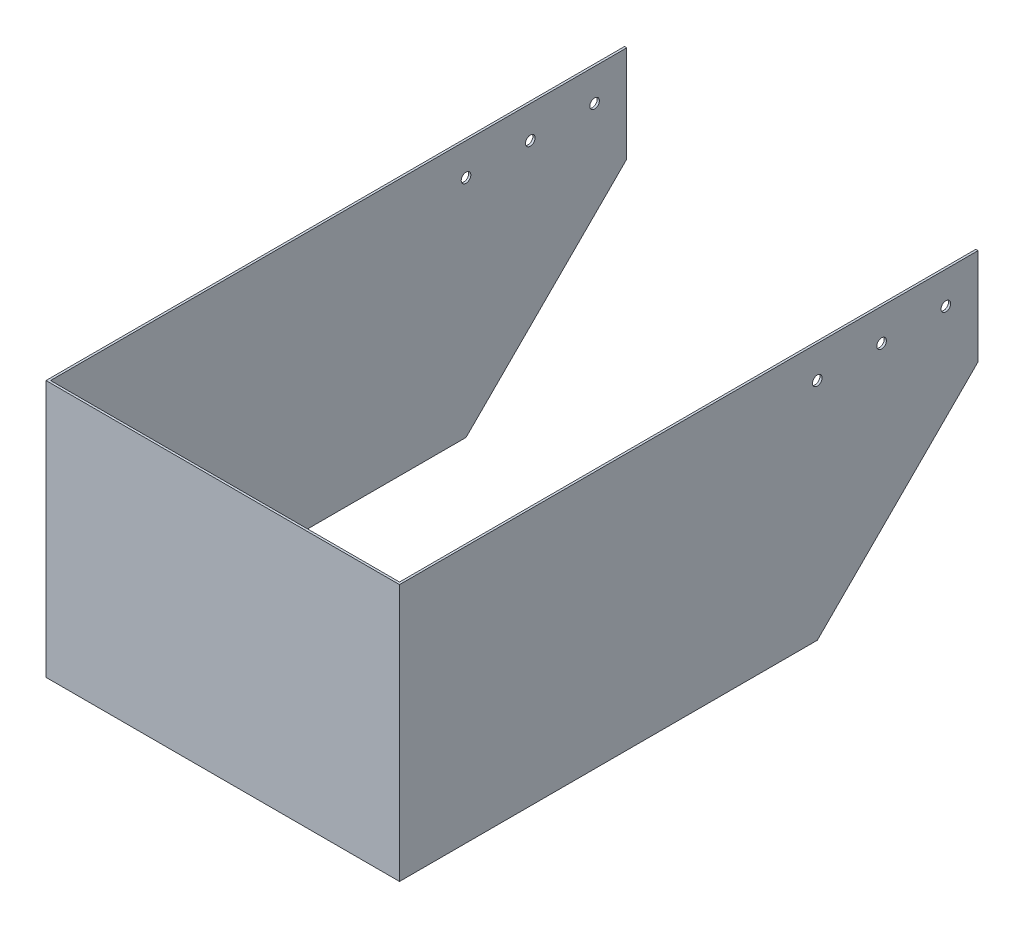
ISO-10303-21;
HEADER;
FILE_DESCRIPTION(('STEP AP214'),'2;1');
FILE_NAME('part.step','',(''),(''),'','','');
FILE_SCHEMA(('AUTOMOTIVE_DESIGN { 1 0 10303 214 1 1 1 1 }'));
ENDSEC;
DATA;
#1=APPLICATION_CONTEXT('core data for automotive mechanical design processes');
#2=APPLICATION_PROTOCOL_DEFINITION('international standard','automotive_design',2000,#1);
#3=PRODUCT_CONTEXT('',#1,'mechanical');
#4=PRODUCT('Part','Part','',(#3));
#5=PRODUCT_RELATED_PRODUCT_CATEGORY('part','',(#4));
#6=PRODUCT_DEFINITION_FORMATION('','',#4);
#7=PRODUCT_DEFINITION_CONTEXT('part definition',#1,'design');
#8=PRODUCT_DEFINITION('design','',#6,#7);
#9=PRODUCT_DEFINITION_SHAPE('','',#8);
#10=(LENGTH_UNIT() NAMED_UNIT(*) SI_UNIT(.MILLI.,.METRE.));
#11=(NAMED_UNIT(*) PLANE_ANGLE_UNIT() SI_UNIT($,.RADIAN.));
#12=(NAMED_UNIT(*) SI_UNIT($,.STERADIAN.) SOLID_ANGLE_UNIT());
#13=UNCERTAINTY_MEASURE_WITH_UNIT(LENGTH_MEASURE(1.E-05),#10,'distance_accuracy_value','');
#14=(GEOMETRIC_REPRESENTATION_CONTEXT(3) GLOBAL_UNCERTAINTY_ASSIGNED_CONTEXT((#13)) GLOBAL_UNIT_ASSIGNED_CONTEXT((#10,
#11,#12)) REPRESENTATION_CONTEXT('',''));
#15=CARTESIAN_POINT('',(0.,0.,0.));
#16=DIRECTION('',(0.,0.,1.));
#17=DIRECTION('',(1.,0.,0.));
#18=AXIS2_PLACEMENT_3D('',#15,#16,#17);
#19=CARTESIAN_POINT('',(0.,80.,-180.));
#20=DIRECTION('',(0.,0.,1.));
#21=DIRECTION('',(1.,0.,0.));
#22=AXIS2_PLACEMENT_3D('',#19,#20,#21);
#23=PLANE('',#22);
#24=DIRECTION('',(0.,1.,0.));
#25=VECTOR('',#24,1.);
#26=CARTESIAN_POINT('',(0.699999999999978,0.,-180.));
#27=LINE('',#26,#25);
#28=CARTESIAN_POINT('',(0.699999999999978,50.,-180.));
#29=VERTEX_POINT('',#28);
#30=CARTESIAN_POINT('',(0.699999999999978,80.,-180.));
#31=VERTEX_POINT('',#30);
#32=EDGE_CURVE('E131',#29,#31,#27,.T.);
#33=ORIENTED_EDGE('',*,*,#32,.F.);
#34=DIRECTION('',(1.,0.,0.));
#35=VECTOR('',#34,1.);
#36=CARTESIAN_POINT('',(-1.11022302462516E-13,50.,-180.));
#37=LINE('',#36,#35);
#38=CARTESIAN_POINT('',(-1.11022302462516E-13,50.,-180.));
#39=VERTEX_POINT('',#38);
#40=EDGE_CURVE('E55',#39,#29,#37,.T.);
#41=ORIENTED_EDGE('',*,*,#40,.F.);
#42=DIRECTION('',(0.,-1.,0.));
#43=VECTOR('',#42,1.);
#44=CARTESIAN_POINT('',(0.,80.,-180.));
#45=LINE('',#44,#43);
#46=CARTESIAN_POINT('',(0.,80.,-180.));
#47=VERTEX_POINT('',#46);
#48=EDGE_CURVE('E129',#47,#39,#45,.T.);
#49=ORIENTED_EDGE('',*,*,#48,.F.);
#50=DIRECTION('',(-1.,0.,0.));
#51=VECTOR('',#50,1.);
#52=CARTESIAN_POINT('',(0.,80.,-180.));
#53=LINE('',#52,#51);
#54=EDGE_CURVE('E147',#31,#47,#53,.T.);
#55=ORIENTED_EDGE('',*,*,#54,.F.);
#56=EDGE_LOOP('',(#33,#41,#49,#55));
#57=FACE_BOUND('',#56,.T.);
#58=ADVANCED_FACE('F39',(#57),#23,.F.);
#59=CARTESIAN_POINT('',(0.,80.,0.));
#60=DIRECTION('',(1.,0.,0.));
#61=DIRECTION('',(0.,0.,-1.));
#62=AXIS2_PLACEMENT_3D('',#59,#60,#61);
#63=PLANE('',#62);
#64=CARTESIAN_POINT('',(0.,70.,-170.));
#65=DIRECTION('',(1.,0.,0.));
#66=DIRECTION('',(0.,0.,-1.));
#67=AXIS2_PLACEMENT_3D('',#64,#65,#66);
#68=CIRCLE('',#67,1.5);
#69=CARTESIAN_POINT('',(0.,70.,-171.5));
#70=VERTEX_POINT('',#69);
#71=EDGE_CURVE('E164',#70,#70,#68,.T.);
#72=ORIENTED_EDGE('',*,*,#71,.T.);
#73=EDGE_LOOP('',(#72));
#74=FACE_BOUND('',#73,.T.);
#75=CARTESIAN_POINT('',(0.,70.,-130.));
#76=DIRECTION('',(1.,0.,0.));
#77=DIRECTION('',(0.,0.,-1.));
#78=AXIS2_PLACEMENT_3D('',#75,#76,#77);
#79=CIRCLE('',#78,1.5);
#80=CARTESIAN_POINT('',(0.,70.,-131.5));
#81=VERTEX_POINT('',#80);
#82=EDGE_CURVE('E261',#81,#81,#79,.T.);
#83=ORIENTED_EDGE('',*,*,#82,.T.);
#84=EDGE_LOOP('',(#83));
#85=FACE_BOUND('',#84,.T.);
#86=CARTESIAN_POINT('',(0.,70.,-150.));
#87=DIRECTION('',(1.,0.,0.));
#88=DIRECTION('',(0.,0.,-1.));
#89=AXIS2_PLACEMENT_3D('',#86,#87,#88);
#90=CIRCLE('',#89,1.49999999999997);
#91=CARTESIAN_POINT('',(0.,70.,-151.5));
#92=VERTEX_POINT('',#91);
#93=EDGE_CURVE('E269',#92,#92,#90,.T.);
#94=ORIENTED_EDGE('',*,*,#93,.T.);
#95=EDGE_LOOP('',(#94));
#96=FACE_BOUND('',#95,.T.);
#97=ORIENTED_EDGE('',*,*,#48,.T.);
#98=DIRECTION('',(0.,-0.707106781186547,0.707106781186548));
#99=VECTOR('',#98,1.);
#100=CARTESIAN_POINT('',(-1.11022302462516E-13,50.,-180.));
#101=LINE('',#100,#99);
#102=CARTESIAN_POINT('',(0.,0.,-130.));
#103=VERTEX_POINT('',#102);
#104=EDGE_CURVE('E114',#39,#103,#101,.T.);
#105=ORIENTED_EDGE('',*,*,#104,.T.);
#106=DIRECTION('',(0.,0.,1.));
#107=VECTOR('',#106,1.);
#108=CARTESIAN_POINT('',(0.,0.,0.));
#109=LINE('',#108,#107);
#110=CARTESIAN_POINT('',(0.,0.,0.));
#111=VERTEX_POINT('',#110);
#112=EDGE_CURVE('E212',#103,#111,#109,.T.);
#113=ORIENTED_EDGE('',*,*,#112,.T.);
#114=DIRECTION('',(0.,-1.,0.));
#115=VECTOR('',#114,1.);
#116=CARTESIAN_POINT('',(0.,80.,0.));
#117=LINE('',#116,#115);
#118=CARTESIAN_POINT('',(0.,80.,0.));
#119=VERTEX_POINT('',#118);
#120=EDGE_CURVE('E48',#119,#111,#117,.T.);
#121=ORIENTED_EDGE('',*,*,#120,.F.);
#122=DIRECTION('',(0.,0.,1.));
#123=VECTOR('',#122,1.);
#124=CARTESIAN_POINT('',(0.,80.,0.));
#125=LINE('',#124,#123);
#126=EDGE_CURVE('E136',#47,#119,#125,.T.);
#127=ORIENTED_EDGE('',*,*,#126,.F.);
#128=EDGE_LOOP('',(#97,#105,#113,#121,#127));
#129=FACE_BOUND('',#128,.T.);
#130=ADVANCED_FACE('F41',(#74,#85,#96,#129),#63,.F.);
#131=CARTESIAN_POINT('',(0.,80.,0.));
#132=DIRECTION('',(0.,0.,-1.));
#133=DIRECTION('',(-1.,0.,0.));
#134=AXIS2_PLACEMENT_3D('',#131,#132,#133);
#135=PLANE('',#134);
#136=DIRECTION('',(1.,0.,0.));
#137=VECTOR('',#136,1.);
#138=CARTESIAN_POINT('',(0.,0.,0.));
#139=LINE('',#138,#137);
#140=CARTESIAN_POINT('',(110.,0.,0.));
#141=VERTEX_POINT('',#140);
#142=EDGE_CURVE('E230',#111,#141,#139,.T.);
#143=ORIENTED_EDGE('',*,*,#142,.T.);
#144=DIRECTION('',(0.,-1.,0.));
#145=VECTOR('',#144,1.);
#146=CARTESIAN_POINT('',(110.,80.,0.));
#147=LINE('',#146,#145);
#148=CARTESIAN_POINT('',(110.,80.,0.));
#149=VERTEX_POINT('',#148);
#150=EDGE_CURVE('E144',#149,#141,#147,.T.);
#151=ORIENTED_EDGE('',*,*,#150,.F.);
#152=DIRECTION('',(1.,0.,0.));
#153=VECTOR('',#152,1.);
#154=CARTESIAN_POINT('',(0.,80.,0.));
#155=LINE('',#154,#153);
#156=EDGE_CURVE('E223',#119,#149,#155,.T.);
#157=ORIENTED_EDGE('',*,*,#156,.F.);
#158=ORIENTED_EDGE('',*,*,#120,.T.);
#159=EDGE_LOOP('',(#143,#151,#157,#158));
#160=FACE_BOUND('',#159,.T.);
#161=ADVANCED_FACE('F281',(#160),#135,.F.);
#162=CARTESIAN_POINT('',(110.,80.,0.));
#163=DIRECTION('',(-1.,0.,0.));
#164=DIRECTION('',(0.,0.,1.));
#165=AXIS2_PLACEMENT_3D('',#162,#163,#164);
#166=PLANE('',#165);
#167=CARTESIAN_POINT('',(110.,70.,-170.));
#168=DIRECTION('',(1.,0.,0.));
#169=DIRECTION('',(0.,0.,-1.));
#170=AXIS2_PLACEMENT_3D('',#167,#168,#169);
#171=CIRCLE('',#170,1.5);
#172=CARTESIAN_POINT('',(110.,70.,-171.5));
#173=VERTEX_POINT('',#172);
#174=EDGE_CURVE('E257',#173,#173,#171,.T.);
#175=ORIENTED_EDGE('',*,*,#174,.F.);
#176=EDGE_LOOP('',(#175));
#177=FACE_BOUND('',#176,.T.);
#178=CARTESIAN_POINT('',(110.,70.,-130.));
#179=DIRECTION('',(1.,0.,0.));
#180=DIRECTION('',(0.,0.,-1.));
#181=AXIS2_PLACEMENT_3D('',#178,#179,#180);
#182=CIRCLE('',#181,1.5);
#183=CARTESIAN_POINT('',(110.,70.,-131.5));
#184=VERTEX_POINT('',#183);
#185=EDGE_CURVE('E265',#184,#184,#182,.T.);
#186=ORIENTED_EDGE('',*,*,#185,.F.);
#187=EDGE_LOOP('',(#186));
#188=FACE_BOUND('',#187,.T.);
#189=CARTESIAN_POINT('',(110.,70.,-150.));
#190=DIRECTION('',(1.,0.,0.));
#191=DIRECTION('',(0.,0.,-1.));
#192=AXIS2_PLACEMENT_3D('',#189,#190,#191);
#193=CIRCLE('',#192,1.49999999999997);
#194=CARTESIAN_POINT('',(110.,70.,-151.5));
#195=VERTEX_POINT('',#194);
#196=EDGE_CURVE('E253',#195,#195,#193,.T.);
#197=ORIENTED_EDGE('',*,*,#196,.F.);
#198=EDGE_LOOP('',(#197));
#199=FACE_BOUND('',#198,.T.);
#200=DIRECTION('',(0.,0.,-1.));
#201=VECTOR('',#200,1.);
#202=CARTESIAN_POINT('',(110.,0.,0.));
#203=LINE('',#202,#201);
#204=CARTESIAN_POINT('',(110.,0.,-130.));
#205=VERTEX_POINT('',#204);
#206=EDGE_CURVE('E150',#141,#205,#203,.T.);
#207=ORIENTED_EDGE('',*,*,#206,.T.);
#208=DIRECTION('',(0.,-0.707106781186547,0.707106781186548));
#209=VECTOR('',#208,1.);
#210=CARTESIAN_POINT('',(110.,50.,-180.));
#211=LINE('',#210,#209);
#212=CARTESIAN_POINT('',(110.,50.,-180.));
#213=VERTEX_POINT('',#212);
#214=EDGE_CURVE('E123',#213,#205,#211,.T.);
#215=ORIENTED_EDGE('',*,*,#214,.F.);
#216=DIRECTION('',(0.,-1.,0.));
#217=VECTOR('',#216,1.);
#218=CARTESIAN_POINT('',(110.,80.,-180.));
#219=LINE('',#218,#217);
#220=CARTESIAN_POINT('',(110.,80.,-180.));
#221=VERTEX_POINT('',#220);
#222=EDGE_CURVE('E138',#221,#213,#219,.T.);
#223=ORIENTED_EDGE('',*,*,#222,.F.);
#224=DIRECTION('',(0.,0.,-1.));
#225=VECTOR('',#224,1.);
#226=CARTESIAN_POINT('',(110.,80.,0.));
#227=LINE('',#226,#225);
#228=EDGE_CURVE('E226',#149,#221,#227,.T.);
#229=ORIENTED_EDGE('',*,*,#228,.F.);
#230=ORIENTED_EDGE('',*,*,#150,.T.);
#231=EDGE_LOOP('',(#207,#215,#223,#229,#230));
#232=FACE_BOUND('',#231,.T.);
#233=ADVANCED_FACE('F240',(#177,#188,#199,#232),#166,.F.);
#234=ORIENTED_EDGE('',*,*,#222,.T.);
#235=CARTESIAN_POINT('',(109.3,50.,-180.));
#236=VERTEX_POINT('',#235);
#237=EDGE_CURVE('E122',#236,#213,#37,.T.);
#238=ORIENTED_EDGE('',*,*,#237,.F.);
#239=DIRECTION('',(0.,1.,0.));
#240=VECTOR('',#239,1.);
#241=CARTESIAN_POINT('',(109.3,0.,-180.));
#242=LINE('',#241,#240);
#243=CARTESIAN_POINT('',(109.3,80.,-180.));
#244=VERTEX_POINT('',#243);
#245=EDGE_CURVE('E213',#236,#244,#242,.T.);
#246=ORIENTED_EDGE('',*,*,#245,.T.);
#247=EDGE_CURVE('E139',#221,#244,#53,.T.);
#248=ORIENTED_EDGE('',*,*,#247,.F.);
#249=EDGE_LOOP('',(#234,#238,#246,#248));
#250=FACE_BOUND('',#249,.T.);
#251=ADVANCED_FACE('F280',(#250),#23,.F.);
#252=CARTESIAN_POINT('',(0.,80.,0.));
#253=DIRECTION('',(0.,-1.,0.));
#254=DIRECTION('',(0.,0.,-1.));
#255=AXIS2_PLACEMENT_3D('',#252,#253,#254);
#256=PLANE('',#255);
#257=DIRECTION('',(1.,0.,0.));
#258=VECTOR('',#257,1.);
#259=CARTESIAN_POINT('',(0.699999999999977,80.,-0.7));
#260=LINE('',#259,#258);
#261=CARTESIAN_POINT('',(0.699999999999977,80.,-0.7));
#262=VERTEX_POINT('',#261);
#263=CARTESIAN_POINT('',(109.3,80.,-0.700000000000006));
#264=VERTEX_POINT('',#263);
#265=EDGE_CURVE('E203',#262,#264,#260,.T.);
#266=ORIENTED_EDGE('',*,*,#265,.F.);
#267=DIRECTION('',(0.,0.,1.));
#268=VECTOR('',#267,1.);
#269=CARTESIAN_POINT('',(0.699999999999978,80.,-180.));
#270=LINE('',#269,#268);
#271=EDGE_CURVE('E178',#31,#262,#270,.T.);
#272=ORIENTED_EDGE('',*,*,#271,.F.);
#273=ORIENTED_EDGE('',*,*,#54,.T.);
#274=ORIENTED_EDGE('',*,*,#126,.T.);
#275=ORIENTED_EDGE('',*,*,#156,.T.);
#276=ORIENTED_EDGE('',*,*,#228,.T.);
#277=ORIENTED_EDGE('',*,*,#247,.T.);
#278=DIRECTION('',(0.,0.,-1.));
#279=VECTOR('',#278,1.);
#280=CARTESIAN_POINT('',(109.3,80.,-180.));
#281=LINE('',#280,#279);
#282=EDGE_CURVE('E191',#264,#244,#281,.T.);
#283=ORIENTED_EDGE('',*,*,#282,.F.);
#284=EDGE_LOOP('',(#266,#272,#273,#274,#275,#276,#277,#283));
#285=FACE_BOUND('',#284,.T.);
#286=ADVANCED_FACE('F288',(#285),#256,.F.);
#287=CARTESIAN_POINT('',(0.,0.,0.));
#288=DIRECTION('',(0.,-1.,0.));
#289=DIRECTION('',(0.,0.,-1.));
#290=AXIS2_PLACEMENT_3D('',#287,#288,#289);
#291=PLANE('',#290);
#292=DIRECTION('',(1.,0.,0.));
#293=VECTOR('',#292,1.);
#294=CARTESIAN_POINT('',(0.,0.,-130.));
#295=LINE('',#294,#293);
#296=CARTESIAN_POINT('',(109.3,0.,-130.));
#297=VERTEX_POINT('',#296);
#298=EDGE_CURVE('E63',#297,#205,#295,.T.);
#299=ORIENTED_EDGE('',*,*,#298,.T.);
#300=ORIENTED_EDGE('',*,*,#206,.F.);
#301=ORIENTED_EDGE('',*,*,#142,.F.);
#302=ORIENTED_EDGE('',*,*,#112,.F.);
#303=CARTESIAN_POINT('',(0.699999999999978,0.,-130.));
#304=VERTEX_POINT('',#303);
#305=EDGE_CURVE('E117',#103,#304,#295,.T.);
#306=ORIENTED_EDGE('',*,*,#305,.T.);
#307=DIRECTION('',(0.,0.,1.));
#308=VECTOR('',#307,1.);
#309=CARTESIAN_POINT('',(0.699999999999978,0.,-180.));
#310=LINE('',#309,#308);
#311=CARTESIAN_POINT('',(0.699999999999977,0.,-0.7));
#312=VERTEX_POINT('',#311);
#313=EDGE_CURVE('E187',#304,#312,#310,.T.);
#314=ORIENTED_EDGE('',*,*,#313,.T.);
#315=DIRECTION('',(1.,0.,0.));
#316=VECTOR('',#315,1.);
#317=CARTESIAN_POINT('',(0.699999999999977,0.,-0.7));
#318=LINE('',#317,#316);
#319=CARTESIAN_POINT('',(109.3,0.,-0.700000000000006));
#320=VERTEX_POINT('',#319);
#321=EDGE_CURVE('E190',#312,#320,#318,.T.);
#322=ORIENTED_EDGE('',*,*,#321,.T.);
#323=DIRECTION('',(0.,0.,-1.));
#324=VECTOR('',#323,1.);
#325=CARTESIAN_POINT('',(109.3,0.,-180.));
#326=LINE('',#325,#324);
#327=EDGE_CURVE('E195',#320,#297,#326,.T.);
#328=ORIENTED_EDGE('',*,*,#327,.T.);
#329=EDGE_LOOP('',(#299,#300,#301,#302,#306,#314,#322,#328));
#330=FACE_BOUND('',#329,.T.);
#331=ADVANCED_FACE('F244',(#330),#291,.T.);
#332=CARTESIAN_POINT('',(0.699999999999978,0.,-180.));
#333=DIRECTION('',(-1.,0.,0.));
#334=DIRECTION('',(0.,0.,1.));
#335=AXIS2_PLACEMENT_3D('',#332,#333,#334);
#336=PLANE('',#335);
#337=CARTESIAN_POINT('',(0.699999999999978,70.,-170.));
#338=DIRECTION('',(-1.,0.,0.));
#339=DIRECTION('',(0.,0.,1.));
#340=AXIS2_PLACEMENT_3D('',#337,#338,#339);
#341=CIRCLE('',#340,1.5);
#342=CARTESIAN_POINT('',(0.699999999999978,70.,-168.5));
#343=VERTEX_POINT('',#342);
#344=EDGE_CURVE('E172',#343,#343,#341,.T.);
#345=ORIENTED_EDGE('',*,*,#344,.T.);
#346=EDGE_LOOP('',(#345));
#347=FACE_BOUND('',#346,.T.);
#348=CARTESIAN_POINT('',(0.699999999999978,70.,-130.));
#349=DIRECTION('',(-1.,0.,0.));
#350=DIRECTION('',(0.,0.,1.));
#351=AXIS2_PLACEMENT_3D('',#348,#349,#350);
#352=CIRCLE('',#351,1.5);
#353=CARTESIAN_POINT('',(0.699999999999978,70.,-128.5));
#354=VERTEX_POINT('',#353);
#355=EDGE_CURVE('E168',#354,#354,#352,.T.);
#356=ORIENTED_EDGE('',*,*,#355,.T.);
#357=EDGE_LOOP('',(#356));
#358=FACE_BOUND('',#357,.T.);
#359=CARTESIAN_POINT('',(0.699999999999978,70.,-150.));
#360=DIRECTION('',(-1.,0.,0.));
#361=DIRECTION('',(0.,0.,1.));
#362=AXIS2_PLACEMENT_3D('',#359,#360,#361);
#363=CIRCLE('',#362,1.49999999999997);
#364=CARTESIAN_POINT('',(0.699999999999978,70.,-148.5));
#365=VERTEX_POINT('',#364);
#366=EDGE_CURVE('E163',#365,#365,#363,.T.);
#367=ORIENTED_EDGE('',*,*,#366,.T.);
#368=EDGE_LOOP('',(#367));
#369=FACE_BOUND('',#368,.T.);
#370=ORIENTED_EDGE('',*,*,#313,.F.);
#371=DIRECTION('',(0.,0.707106781186547,-0.707106781186548));
#372=VECTOR('',#371,1.);
#373=CARTESIAN_POINT('',(0.699999999999978,25.,-155.));
#374=LINE('',#373,#372);
#375=EDGE_CURVE('E248',#304,#29,#374,.T.);
#376=ORIENTED_EDGE('',*,*,#375,.T.);
#377=ORIENTED_EDGE('',*,*,#32,.T.);
#378=ORIENTED_EDGE('',*,*,#271,.T.);
#379=DIRECTION('',(0.,1.,0.));
#380=VECTOR('',#379,1.);
#381=CARTESIAN_POINT('',(0.699999999999977,0.,-0.7));
#382=LINE('',#381,#380);
#383=EDGE_CURVE('E199',#312,#262,#382,.T.);
#384=ORIENTED_EDGE('',*,*,#383,.F.);
#385=EDGE_LOOP('',(#370,#376,#377,#378,#384));
#386=FACE_BOUND('',#385,.T.);
#387=ADVANCED_FACE('F301',(#347,#358,#369,#386),#336,.F.);
#388=CARTESIAN_POINT('',(109.3,0.,-180.));
#389=DIRECTION('',(1.,0.,0.));
#390=DIRECTION('',(0.,0.,-1.));
#391=AXIS2_PLACEMENT_3D('',#388,#389,#390);
#392=PLANE('',#391);
#393=CARTESIAN_POINT('',(109.3,70.,-170.));
#394=DIRECTION('',(1.,0.,0.));
#395=DIRECTION('',(0.,0.,-1.));
#396=AXIS2_PLACEMENT_3D('',#393,#394,#395);
#397=CIRCLE('',#396,1.5);
#398=CARTESIAN_POINT('',(109.3,70.,-171.5));
#399=VERTEX_POINT('',#398);
#400=EDGE_CURVE('E169',#399,#399,#397,.T.);
#401=ORIENTED_EDGE('',*,*,#400,.T.);
#402=EDGE_LOOP('',(#401));
#403=FACE_BOUND('',#402,.T.);
#404=CARTESIAN_POINT('',(109.3,70.,-130.));
#405=DIRECTION('',(1.,0.,0.));
#406=DIRECTION('',(0.,0.,-1.));
#407=AXIS2_PLACEMENT_3D('',#404,#405,#406);
#408=CIRCLE('',#407,1.5);
#409=CARTESIAN_POINT('',(109.3,70.,-131.5));
#410=VERTEX_POINT('',#409);
#411=EDGE_CURVE('E165',#410,#410,#408,.T.);
#412=ORIENTED_EDGE('',*,*,#411,.T.);
#413=EDGE_LOOP('',(#412));
#414=FACE_BOUND('',#413,.T.);
#415=CARTESIAN_POINT('',(109.3,70.,-150.));
#416=DIRECTION('',(1.,0.,0.));
#417=DIRECTION('',(0.,0.,-1.));
#418=AXIS2_PLACEMENT_3D('',#415,#416,#417);
#419=CIRCLE('',#418,1.49999999999997);
#420=CARTESIAN_POINT('',(109.3,70.,-151.5));
#421=VERTEX_POINT('',#420);
#422=EDGE_CURVE('E159',#421,#421,#419,.T.);
#423=ORIENTED_EDGE('',*,*,#422,.T.);
#424=EDGE_LOOP('',(#423));
#425=FACE_BOUND('',#424,.T.);
#426=ORIENTED_EDGE('',*,*,#245,.F.);
#427=DIRECTION('',(0.,-0.707106781186547,0.707106781186548));
#428=VECTOR('',#427,1.);
#429=CARTESIAN_POINT('',(109.3,25.,-155.));
#430=LINE('',#429,#428);
#431=EDGE_CURVE('E11',#236,#297,#430,.T.);
#432=ORIENTED_EDGE('',*,*,#431,.T.);
#433=ORIENTED_EDGE('',*,*,#327,.F.);
#434=DIRECTION('',(0.,1.,0.));
#435=VECTOR('',#434,1.);
#436=CARTESIAN_POINT('',(109.3,0.,-0.700000000000006));
#437=LINE('',#436,#435);
#438=EDGE_CURVE('E216',#320,#264,#437,.T.);
#439=ORIENTED_EDGE('',*,*,#438,.T.);
#440=ORIENTED_EDGE('',*,*,#282,.T.);
#441=EDGE_LOOP('',(#426,#432,#433,#439,#440));
#442=FACE_BOUND('',#441,.T.);
#443=ADVANCED_FACE('F307',(#403,#414,#425,#442),#392,.F.);
#444=CARTESIAN_POINT('',(0.699999999999977,0.,-0.7));
#445=DIRECTION('',(0.,0.,1.));
#446=DIRECTION('',(1.,0.,0.));
#447=AXIS2_PLACEMENT_3D('',#444,#445,#446);
#448=PLANE('',#447);
#449=ORIENTED_EDGE('',*,*,#265,.T.);
#450=ORIENTED_EDGE('',*,*,#438,.F.);
#451=ORIENTED_EDGE('',*,*,#321,.F.);
#452=ORIENTED_EDGE('',*,*,#383,.T.);
#453=EDGE_LOOP('',(#449,#450,#451,#452));
#454=FACE_BOUND('',#453,.T.);
#455=ADVANCED_FACE('F309',(#454),#448,.F.);
#456=CARTESIAN_POINT('',(0.,70.,-150.));
#457=DIRECTION('',(1.,0.,0.));
#458=DIRECTION('',(0.,0.,-1.));
#459=AXIS2_PLACEMENT_3D('',#456,#457,#458);
#460=CYLINDRICAL_SURFACE('',#459,1.49999999999997);
#461=ORIENTED_EDGE('',*,*,#196,.T.);
#462=EDGE_LOOP('',(#461));
#463=FACE_BOUND('',#462,.T.);
#464=ORIENTED_EDGE('',*,*,#422,.F.);
#465=EDGE_LOOP('',(#464));
#466=FACE_BOUND('',#465,.T.);
#467=ADVANCED_FACE('F276',(#463,#466),#460,.F.);
#468=CARTESIAN_POINT('',(0.,70.,-130.));
#469=DIRECTION('',(1.,0.,0.));
#470=DIRECTION('',(0.,0.,-1.));
#471=AXIS2_PLACEMENT_3D('',#468,#469,#470);
#472=CYLINDRICAL_SURFACE('',#471,1.5);
#473=ORIENTED_EDGE('',*,*,#185,.T.);
#474=EDGE_LOOP('',(#473));
#475=FACE_BOUND('',#474,.T.);
#476=ORIENTED_EDGE('',*,*,#411,.F.);
#477=EDGE_LOOP('',(#476));
#478=FACE_BOUND('',#477,.T.);
#479=ADVANCED_FACE('F325',(#475,#478),#472,.F.);
#480=CARTESIAN_POINT('',(0.,70.,-170.));
#481=DIRECTION('',(1.,0.,0.));
#482=DIRECTION('',(0.,0.,-1.));
#483=AXIS2_PLACEMENT_3D('',#480,#481,#482);
#484=CYLINDRICAL_SURFACE('',#483,1.5);
#485=ORIENTED_EDGE('',*,*,#174,.T.);
#486=EDGE_LOOP('',(#485));
#487=FACE_BOUND('',#486,.T.);
#488=ORIENTED_EDGE('',*,*,#400,.F.);
#489=EDGE_LOOP('',(#488));
#490=FACE_BOUND('',#489,.T.);
#491=ADVANCED_FACE('F319',(#487,#490),#484,.F.);
#492=ORIENTED_EDGE('',*,*,#93,.F.);
#493=EDGE_LOOP('',(#492));
#494=FACE_BOUND('',#493,.T.);
#495=ORIENTED_EDGE('',*,*,#366,.F.);
#496=EDGE_LOOP('',(#495));
#497=FACE_BOUND('',#496,.T.);
#498=ADVANCED_FACE('F315',(#494,#497),#460,.F.);
#499=ORIENTED_EDGE('',*,*,#82,.F.);
#500=EDGE_LOOP('',(#499));
#501=FACE_BOUND('',#500,.T.);
#502=ORIENTED_EDGE('',*,*,#355,.F.);
#503=EDGE_LOOP('',(#502));
#504=FACE_BOUND('',#503,.T.);
#505=ADVANCED_FACE('F318',(#501,#504),#472,.F.);
#506=ORIENTED_EDGE('',*,*,#71,.F.);
#507=EDGE_LOOP('',(#506));
#508=FACE_BOUND('',#507,.T.);
#509=ORIENTED_EDGE('',*,*,#344,.F.);
#510=EDGE_LOOP('',(#509));
#511=FACE_BOUND('',#510,.T.);
#512=ADVANCED_FACE('F323',(#508,#511),#484,.F.);
#513=CARTESIAN_POINT('',(-1.11022302462516E-13,50.,-180.));
#514=DIRECTION('',(0.,0.707106781186548,0.707106781186547));
#515=DIRECTION('',(0.,-0.707106781186547,0.707106781186548));
#516=AXIS2_PLACEMENT_3D('',#513,#514,#515);
#517=PLANE('',#516);
#518=ORIENTED_EDGE('',*,*,#237,.T.);
#519=ORIENTED_EDGE('',*,*,#214,.T.);
#520=ORIENTED_EDGE('',*,*,#298,.F.);
#521=ORIENTED_EDGE('',*,*,#431,.F.);
#522=EDGE_LOOP('',(#518,#519,#520,#521));
#523=FACE_BOUND('',#522,.T.);
#524=ADVANCED_FACE('F328',(#523),#517,.F.);
#525=ORIENTED_EDGE('',*,*,#305,.F.);
#526=ORIENTED_EDGE('',*,*,#104,.F.);
#527=ORIENTED_EDGE('',*,*,#40,.T.);
#528=ORIENTED_EDGE('',*,*,#375,.F.);
#529=EDGE_LOOP('',(#525,#526,#527,#528));
#530=FACE_BOUND('',#529,.T.);
#531=ADVANCED_FACE('F115',(#530),#517,.F.);
#532=CLOSED_SHELL('',(#58,#130,#161,#233,#251,#286,#331,#387,#443,#455,#467,#479,#491,#498,#505,
#512,#524,#531));
#533=MANIFOLD_SOLID_BREP('B2',#532);
#534=ADVANCED_BREP_SHAPE_REPRESENTATION('',(#18,#533),#14);
#535=SHAPE_DEFINITION_REPRESENTATION(#9,#534);
ENDSEC;
END-ISO-10303-21;
